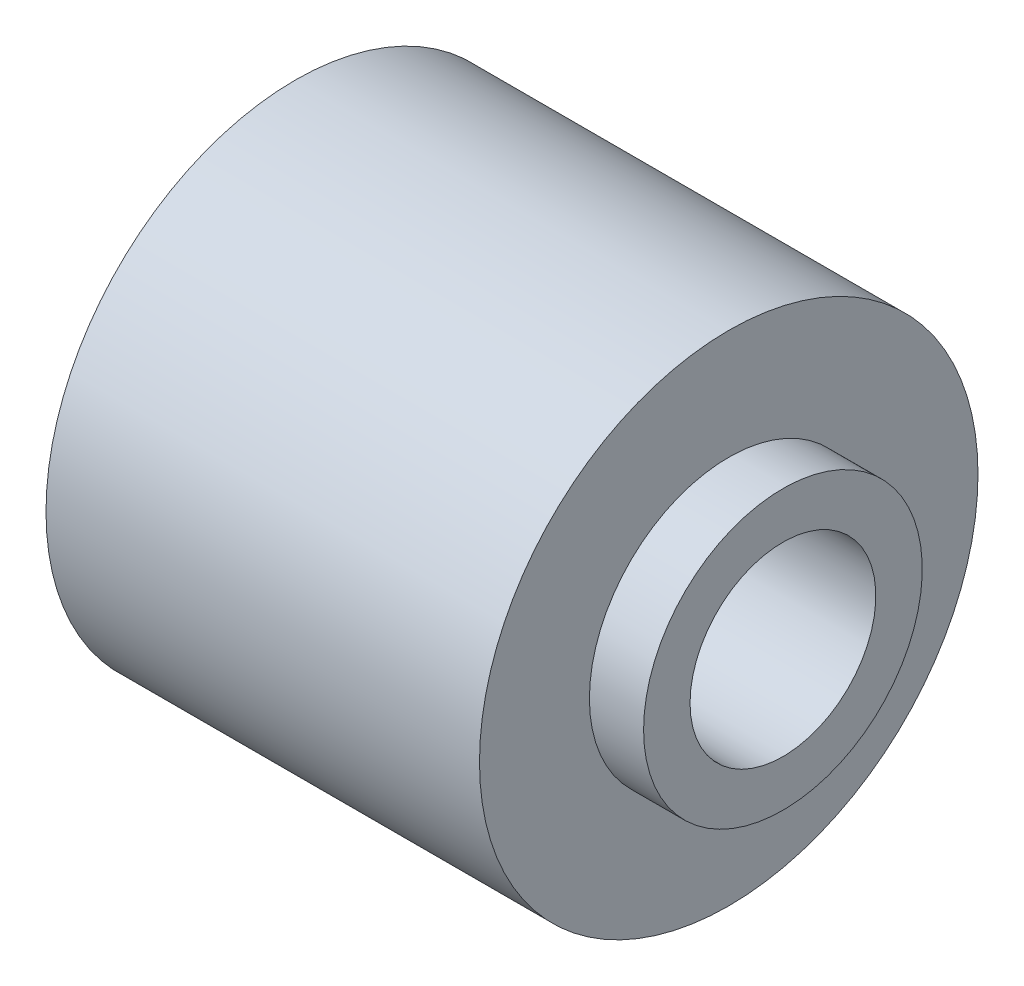
ISO-10303-21;
HEADER;
FILE_DESCRIPTION(('STEP AP214'),'2;1');
FILE_NAME('part.step','',(''),(''),'','','');
FILE_SCHEMA(('AUTOMOTIVE_DESIGN { 1 0 10303 214 1 1 1 1 }'));
ENDSEC;
DATA;
#1=APPLICATION_CONTEXT('core data for automotive mechanical design processes');
#2=APPLICATION_PROTOCOL_DEFINITION('international standard','automotive_design',2000,#1);
#3=PRODUCT_CONTEXT('',#1,'mechanical');
#4=PRODUCT('Part','Part','',(#3));
#5=PRODUCT_RELATED_PRODUCT_CATEGORY('part','',(#4));
#6=PRODUCT_DEFINITION_FORMATION('','',#4);
#7=PRODUCT_DEFINITION_CONTEXT('part definition',#1,'design');
#8=PRODUCT_DEFINITION('design','',#6,#7);
#9=PRODUCT_DEFINITION_SHAPE('','',#8);
#10=(LENGTH_UNIT() NAMED_UNIT(*) SI_UNIT(.MILLI.,.METRE.));
#11=(NAMED_UNIT(*) PLANE_ANGLE_UNIT() SI_UNIT($,.RADIAN.));
#12=(NAMED_UNIT(*) SI_UNIT($,.STERADIAN.) SOLID_ANGLE_UNIT());
#13=UNCERTAINTY_MEASURE_WITH_UNIT(LENGTH_MEASURE(1.E-05),#10,'distance_accuracy_value','');
#14=(GEOMETRIC_REPRESENTATION_CONTEXT(3) GLOBAL_UNCERTAINTY_ASSIGNED_CONTEXT((#13)) GLOBAL_UNIT_ASSIGNED_CONTEXT((#10,
#11,#12)) REPRESENTATION_CONTEXT('',''));
#15=CARTESIAN_POINT('',(0.,0.,0.));
#16=DIRECTION('',(0.,0.,1.));
#17=DIRECTION('',(1.,0.,0.));
#18=AXIS2_PLACEMENT_3D('',#15,#16,#17);
#19=CARTESIAN_POINT('',(17.5,0.,-9.));
#20=DIRECTION('',(-1.,0.,0.));
#21=DIRECTION('',(0.,0.,1.));
#22=AXIS2_PLACEMENT_3D('',#19,#20,#21);
#23=PLANE('',#22);
#24=CARTESIAN_POINT('',(17.5,0.,0.));
#25=DIRECTION('',(-1.,0.,0.));
#26=DIRECTION('',(0.,0.,1.));
#27=AXIS2_PLACEMENT_3D('',#24,#25,#26);
#28=CIRCLE('',#27,8.99999999999999);
#29=CARTESIAN_POINT('',(17.5,0.,8.99999999999999));
#30=VERTEX_POINT('',#29);
#31=EDGE_CURVE('E38',#30,#30,#28,.T.);
#32=ORIENTED_EDGE('',*,*,#31,.F.);
#33=EDGE_LOOP('',(#32));
#34=FACE_BOUND('',#33,.T.);
#35=CARTESIAN_POINT('',(17.5,0.,0.));
#36=DIRECTION('',(-1.,0.,0.));
#37=DIRECTION('',(0.,0.,1.));
#38=AXIS2_PLACEMENT_3D('',#35,#36,#37);
#39=CIRCLE('',#38,6.);
#40=CARTESIAN_POINT('',(17.5,0.,5.99999999999999));
#41=VERTEX_POINT('',#40);
#42=EDGE_CURVE('E10',#41,#41,#39,.T.);
#43=ORIENTED_EDGE('',*,*,#42,.T.);
#44=EDGE_LOOP('',(#43));
#45=FACE_BOUND('',#44,.T.);
#46=ADVANCED_FACE('F32',(#34,#45),#23,.F.);
#47=CARTESIAN_POINT('',(-14.,0.,0.));
#48=DIRECTION('',(-1.,0.,0.));
#49=DIRECTION('',(0.,0.,1.));
#50=AXIS2_PLACEMENT_3D('',#47,#48,#49);
#51=CYLINDRICAL_SURFACE('',#50,9.);
#52=CARTESIAN_POINT('',(14.,0.,0.));
#53=DIRECTION('',(-1.,0.,0.));
#54=DIRECTION('',(0.,0.,1.));
#55=AXIS2_PLACEMENT_3D('',#52,#53,#54);
#56=CIRCLE('',#55,9.);
#57=CARTESIAN_POINT('',(14.,0.,8.99999999999999));
#58=VERTEX_POINT('',#57);
#59=EDGE_CURVE('E42',#58,#58,#56,.T.);
#60=ORIENTED_EDGE('',*,*,#59,.F.);
#61=EDGE_LOOP('',(#60));
#62=FACE_BOUND('',#61,.T.);
#63=ORIENTED_EDGE('',*,*,#31,.T.);
#64=EDGE_LOOP('',(#63));
#65=FACE_BOUND('',#64,.T.);
#66=ADVANCED_FACE('F94',(#62,#65),#51,.T.);
#67=CARTESIAN_POINT('',(14.,0.,-16.1));
#68=DIRECTION('',(-1.,0.,0.));
#69=DIRECTION('',(0.,0.,1.));
#70=AXIS2_PLACEMENT_3D('',#67,#68,#69);
#71=PLANE('',#70);
#72=CARTESIAN_POINT('',(14.,0.,0.));
#73=DIRECTION('',(-1.,0.,0.));
#74=DIRECTION('',(0.,0.,1.));
#75=AXIS2_PLACEMENT_3D('',#72,#73,#74);
#76=CIRCLE('',#75,16.1);
#77=CARTESIAN_POINT('',(14.,0.,16.1));
#78=VERTEX_POINT('',#77);
#79=EDGE_CURVE('E46',#78,#78,#76,.T.);
#80=ORIENTED_EDGE('',*,*,#79,.F.);
#81=EDGE_LOOP('',(#80));
#82=FACE_BOUND('',#81,.T.);
#83=ORIENTED_EDGE('',*,*,#59,.T.);
#84=EDGE_LOOP('',(#83));
#85=FACE_BOUND('',#84,.T.);
#86=ADVANCED_FACE('F88',(#82,#85),#71,.F.);
#87=CARTESIAN_POINT('',(-14.,0.,0.));
#88=DIRECTION('',(-1.,0.,0.));
#89=DIRECTION('',(0.,0.,1.));
#90=AXIS2_PLACEMENT_3D('',#87,#88,#89);
#91=CYLINDRICAL_SURFACE('',#90,16.1);
#92=CARTESIAN_POINT('',(-14.,0.,0.));
#93=DIRECTION('',(-1.,0.,0.));
#94=DIRECTION('',(0.,0.,1.));
#95=AXIS2_PLACEMENT_3D('',#92,#93,#94);
#96=CIRCLE('',#95,16.1);
#97=CARTESIAN_POINT('',(-14.,0.,16.1));
#98=VERTEX_POINT('',#97);
#99=EDGE_CURVE('E51',#98,#98,#96,.T.);
#100=ORIENTED_EDGE('',*,*,#99,.F.);
#101=EDGE_LOOP('',(#100));
#102=FACE_BOUND('',#101,.T.);
#103=ORIENTED_EDGE('',*,*,#79,.T.);
#104=EDGE_LOOP('',(#103));
#105=FACE_BOUND('',#104,.T.);
#106=ADVANCED_FACE('F82',(#102,#105),#91,.T.);
#107=CARTESIAN_POINT('',(-14.,0.,-16.1));
#108=DIRECTION('',(1.,0.,0.));
#109=DIRECTION('',(0.,0.,-1.));
#110=AXIS2_PLACEMENT_3D('',#107,#108,#109);
#111=PLANE('',#110);
#112=CARTESIAN_POINT('',(-14.,0.,0.));
#113=DIRECTION('',(-1.,0.,0.));
#114=DIRECTION('',(0.,0.,1.));
#115=AXIS2_PLACEMENT_3D('',#112,#113,#114);
#116=CIRCLE('',#115,9.);
#117=CARTESIAN_POINT('',(-14.,0.,9.));
#118=VERTEX_POINT('',#117);
#119=EDGE_CURVE('E54',#118,#118,#116,.T.);
#120=ORIENTED_EDGE('',*,*,#119,.F.);
#121=EDGE_LOOP('',(#120));
#122=FACE_BOUND('',#121,.T.);
#123=ORIENTED_EDGE('',*,*,#99,.T.);
#124=EDGE_LOOP('',(#123));
#125=FACE_BOUND('',#124,.T.);
#126=ADVANCED_FACE('F76',(#122,#125),#111,.F.);
#127=CARTESIAN_POINT('',(-14.,0.,0.));
#128=DIRECTION('',(-1.,0.,0.));
#129=DIRECTION('',(0.,0.,1.));
#130=AXIS2_PLACEMENT_3D('',#127,#128,#129);
#131=CYLINDRICAL_SURFACE('',#130,9.);
#132=CARTESIAN_POINT('',(-17.5,0.,0.));
#133=DIRECTION('',(-1.,0.,0.));
#134=DIRECTION('',(0.,0.,1.));
#135=AXIS2_PLACEMENT_3D('',#132,#133,#134);
#136=CIRCLE('',#135,9.);
#137=CARTESIAN_POINT('',(-17.5,0.,9.));
#138=VERTEX_POINT('',#137);
#139=EDGE_CURVE('E57',#138,#138,#136,.T.);
#140=ORIENTED_EDGE('',*,*,#139,.F.);
#141=EDGE_LOOP('',(#140));
#142=FACE_BOUND('',#141,.T.);
#143=ORIENTED_EDGE('',*,*,#119,.T.);
#144=EDGE_LOOP('',(#143));
#145=FACE_BOUND('',#144,.T.);
#146=ADVANCED_FACE('F70',(#142,#145),#131,.T.);
#147=CARTESIAN_POINT('',(-17.5,0.,-6.));
#148=DIRECTION('',(1.,0.,0.));
#149=DIRECTION('',(0.,0.,-1.));
#150=AXIS2_PLACEMENT_3D('',#147,#148,#149);
#151=PLANE('',#150);
#152=CARTESIAN_POINT('',(-17.5,0.,0.));
#153=DIRECTION('',(-1.,0.,0.));
#154=DIRECTION('',(0.,0.,1.));
#155=AXIS2_PLACEMENT_3D('',#152,#153,#154);
#156=CIRCLE('',#155,6.);
#157=CARTESIAN_POINT('',(-17.5,0.,6.));
#158=VERTEX_POINT('',#157);
#159=EDGE_CURVE('E60',#158,#158,#156,.T.);
#160=ORIENTED_EDGE('',*,*,#159,.F.);
#161=EDGE_LOOP('',(#160));
#162=FACE_BOUND('',#161,.T.);
#163=ORIENTED_EDGE('',*,*,#139,.T.);
#164=EDGE_LOOP('',(#163));
#165=FACE_BOUND('',#164,.T.);
#166=ADVANCED_FACE('F67',(#162,#165),#151,.F.);
#167=CARTESIAN_POINT('',(-14.,0.,0.));
#168=DIRECTION('',(-1.,0.,0.));
#169=DIRECTION('',(0.,0.,1.));
#170=AXIS2_PLACEMENT_3D('',#167,#168,#169);
#171=CYLINDRICAL_SURFACE('',#170,6.);
#172=ORIENTED_EDGE('',*,*,#159,.T.);
#173=EDGE_LOOP('',(#172));
#174=FACE_BOUND('',#173,.T.);
#175=ORIENTED_EDGE('',*,*,#42,.F.);
#176=EDGE_LOOP('',(#175));
#177=FACE_BOUND('',#176,.T.);
#178=ADVANCED_FACE('F64',(#174,#177),#171,.F.);
#179=CLOSED_SHELL('',(#46,#66,#86,#106,#126,#146,#166,#178));
#180=MANIFOLD_SOLID_BREP('B2',#179);
#181=ADVANCED_BREP_SHAPE_REPRESENTATION('',(#18,#180),#14);
#182=SHAPE_DEFINITION_REPRESENTATION(#9,#181);
ENDSEC;
END-ISO-10303-21;
